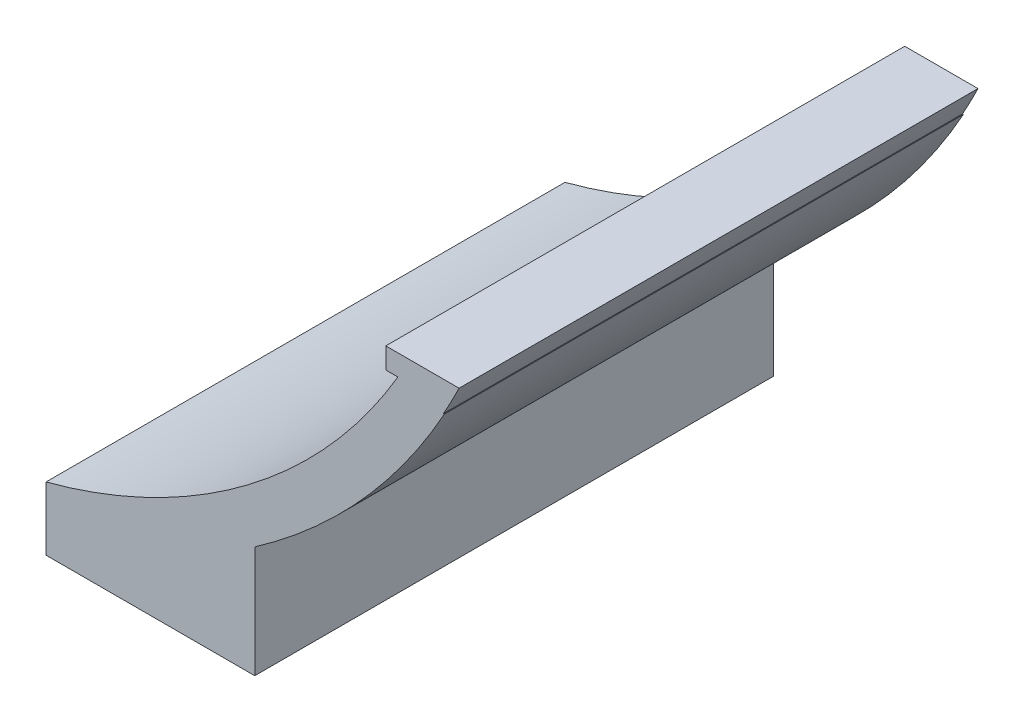
ISO-10303-21;
HEADER;
FILE_DESCRIPTION(('STEP AP214'),'2;1');
FILE_NAME('part.step','',(''),(''),'','','');
FILE_SCHEMA(('AUTOMOTIVE_DESIGN { 1 0 10303 214 1 1 1 1 }'));
ENDSEC;
DATA;
#1=APPLICATION_CONTEXT('core data for automotive mechanical design processes');
#2=APPLICATION_PROTOCOL_DEFINITION('international standard','automotive_design',2000,#1);
#3=PRODUCT_CONTEXT('',#1,'mechanical');
#4=PRODUCT('Part','Part','',(#3));
#5=PRODUCT_RELATED_PRODUCT_CATEGORY('part','',(#4));
#6=PRODUCT_DEFINITION_FORMATION('','',#4);
#7=PRODUCT_DEFINITION_CONTEXT('part definition',#1,'design');
#8=PRODUCT_DEFINITION('design','',#6,#7);
#9=PRODUCT_DEFINITION_SHAPE('','',#8);
#10=(LENGTH_UNIT() NAMED_UNIT(*) SI_UNIT(.MILLI.,.METRE.));
#11=(NAMED_UNIT(*) PLANE_ANGLE_UNIT() SI_UNIT($,.RADIAN.));
#12=(NAMED_UNIT(*) SI_UNIT($,.STERADIAN.) SOLID_ANGLE_UNIT());
#13=UNCERTAINTY_MEASURE_WITH_UNIT(LENGTH_MEASURE(1.E-05),#10,'distance_accuracy_value','');
#14=(GEOMETRIC_REPRESENTATION_CONTEXT(3) GLOBAL_UNCERTAINTY_ASSIGNED_CONTEXT((#13)) GLOBAL_UNIT_ASSIGNED_CONTEXT((#10,
#11,#12)) REPRESENTATION_CONTEXT('',''));
#15=CARTESIAN_POINT('',(0.,0.,0.));
#16=DIRECTION('',(0.,0.,1.));
#17=DIRECTION('',(1.,0.,0.));
#18=AXIS2_PLACEMENT_3D('',#15,#16,#17);
#19=CARTESIAN_POINT('',(0.,0.,174.));
#20=DIRECTION('',(0.,0.,-1.));
#21=DIRECTION('',(-1.,0.,0.));
#22=AXIS2_PLACEMENT_3D('',#19,#20,#21);
#23=CYLINDRICAL_SURFACE('',#22,210.);
#24=CARTESIAN_POINT('',(0.,0.,174.));
#25=DIRECTION('',(0.,0.,1.));
#26=DIRECTION('',(1.,0.,0.));
#27=AXIS2_PLACEMENT_3D('',#24,#25,#26);
#28=CIRCLE('',#27,210.);
#29=CARTESIAN_POINT('',(120.,-172.336879396141,174.));
#30=VERTEX_POINT('',#29);
#31=CARTESIAN_POINT('',(183.56470248934,-102.,174.));
#32=VERTEX_POINT('',#31);
#33=EDGE_CURVE('E179',#30,#32,#28,.T.);
#34=ORIENTED_EDGE('',*,*,#33,.F.);
#35=DIRECTION('',(0.,0.,1.));
#36=VECTOR('',#35,1.);
#37=CARTESIAN_POINT('',(120.,-172.336879396141,-115.957504903706));
#38=LINE('',#37,#36);
#39=CARTESIAN_POINT('',(120.,-172.336879396141,0.));
#40=VERTEX_POINT('',#39);
#41=EDGE_CURVE('E166',#40,#30,#38,.T.);
#42=ORIENTED_EDGE('',*,*,#41,.F.);
#43=CARTESIAN_POINT('',(0.,0.,0.));
#44=DIRECTION('',(0.,0.,1.));
#45=DIRECTION('',(1.,0.,0.));
#46=AXIS2_PLACEMENT_3D('',#43,#44,#45);
#47=CIRCLE('',#46,210.);
#48=CARTESIAN_POINT('',(183.56470248934,-102.,0.));
#49=VERTEX_POINT('',#48);
#50=EDGE_CURVE('E47',#40,#49,#47,.T.);
#51=ORIENTED_EDGE('',*,*,#50,.T.);
#52=DIRECTION('',(0.,0.,-1.));
#53=VECTOR('',#52,1.);
#54=CARTESIAN_POINT('',(183.56470248934,-102.,174.));
#55=LINE('',#54,#53);
#56=EDGE_CURVE('E201',#49,#32,#55,.F.);
#57=ORIENTED_EDGE('',*,*,#56,.T.);
#58=EDGE_LOOP('',(#34,#42,#51,#57));
#59=FACE_BOUND('',#58,.T.);
#60=ADVANCED_FACE('F43',(#59),#23,.T.);
#61=CARTESIAN_POINT('',(0.,-102.,-5.64183047049638));
#62=DIRECTION('',(0.,-1.,0.));
#63=DIRECTION('',(0.,0.,-1.));
#64=AXIS2_PLACEMENT_3D('',#61,#62,#63);
#65=PLANE('',#64);
#66=DIRECTION('',(-1.,0.,0.));
#67=VECTOR('',#66,1.);
#68=CARTESIAN_POINT('',(0.,-102.,0.));
#69=LINE('',#68,#67);
#70=CARTESIAN_POINT('',(183.278647146906,-102.,0.));
#71=VERTEX_POINT('',#70);
#72=EDGE_CURVE('E204',#49,#71,#69,.T.);
#73=ORIENTED_EDGE('',*,*,#72,.T.);
#74=DIRECTION('',(0.,0.,1.));
#75=VECTOR('',#74,1.);
#76=CARTESIAN_POINT('',(183.278647146906,-102.,-394.954823365914));
#77=LINE('',#76,#75);
#78=CARTESIAN_POINT('',(183.278647146906,-102.,174.));
#79=VERTEX_POINT('',#78);
#80=EDGE_CURVE('E142',#71,#79,#77,.T.);
#81=ORIENTED_EDGE('',*,*,#80,.T.);
#82=DIRECTION('',(1.,0.,0.));
#83=VECTOR('',#82,1.);
#84=CARTESIAN_POINT('',(0.,-102.,174.));
#85=LINE('',#84,#83);
#86=EDGE_CURVE('E108',#79,#32,#85,.T.);
#87=ORIENTED_EDGE('',*,*,#86,.T.);
#88=ORIENTED_EDGE('',*,*,#56,.F.);
#89=EDGE_LOOP('',(#73,#81,#87,#88));
#90=FACE_BOUND('',#89,.T.);
#91=ADVANCED_FACE('F208',(#90),#65,.F.);
#92=CARTESIAN_POINT('',(0.,0.,-394.954823365914));
#93=DIRECTION('',(0.,0.,1.));
#94=DIRECTION('',(1.,0.,0.));
#95=AXIS2_PLACEMENT_3D('',#92,#93,#94);
#96=CYLINDRICAL_SURFACE('',#95,209.75);
#97=ORIENTED_EDGE('',*,*,#80,.F.);
#98=CARTESIAN_POINT('',(0.,0.,0.));
#99=DIRECTION('',(0.,0.,1.));
#100=DIRECTION('',(1.,0.,0.));
#101=AXIS2_PLACEMENT_3D('',#98,#99,#100);
#102=CIRCLE('',#101,209.75);
#103=CARTESIAN_POINT('',(188.496850106308,-92.0000000000001,0.));
#104=VERTEX_POINT('',#103);
#105=EDGE_CURVE('E130',#104,#71,#102,.F.);
#106=ORIENTED_EDGE('',*,*,#105,.F.);
#107=DIRECTION('',(0.,0.,1.));
#108=VECTOR('',#107,1.);
#109=CARTESIAN_POINT('',(188.496850106308,-92.0000000000001,-394.954823365914));
#110=LINE('',#109,#108);
#111=CARTESIAN_POINT('',(188.496850106308,-92.0000000000001,174.));
#112=VERTEX_POINT('',#111);
#113=EDGE_CURVE('E140',#104,#112,#110,.T.);
#114=ORIENTED_EDGE('',*,*,#113,.T.);
#115=CARTESIAN_POINT('',(0.,0.,174.));
#116=DIRECTION('',(0.,0.,1.));
#117=DIRECTION('',(1.,0.,0.));
#118=AXIS2_PLACEMENT_3D('',#115,#116,#117);
#119=CIRCLE('',#118,209.75);
#120=EDGE_CURVE('E157',#79,#112,#119,.T.);
#121=ORIENTED_EDGE('',*,*,#120,.F.);
#122=EDGE_LOOP('',(#97,#106,#114,#121));
#123=FACE_BOUND('',#122,.T.);
#124=ADVANCED_FACE('F138',(#123),#96,.T.);
#125=CARTESIAN_POINT('',(171.933126534708,-92.,-394.954823365914));
#126=DIRECTION('',(0.,1.,0.));
#127=DIRECTION('',(0.,0.,1.));
#128=AXIS2_PLACEMENT_3D('',#125,#126,#127);
#129=PLANE('',#128);
#130=DIRECTION('',(1.,0.,0.));
#131=VECTOR('',#130,1.);
#132=CARTESIAN_POINT('',(171.933126534708,-92.,0.));
#133=LINE('',#132,#131);
#134=CARTESIAN_POINT('',(163.933126534708,-92.,0.));
#135=VERTEX_POINT('',#134);
#136=EDGE_CURVE('E99',#135,#104,#133,.T.);
#137=ORIENTED_EDGE('',*,*,#136,.F.);
#138=DIRECTION('',(0.,0.,-1.));
#139=VECTOR('',#138,1.);
#140=CARTESIAN_POINT('',(163.933126534708,-92.,183.45827557051));
#141=LINE('',#140,#139);
#142=CARTESIAN_POINT('',(163.933126534708,-92.,174.));
#143=VERTEX_POINT('',#142);
#144=EDGE_CURVE('E150',#143,#135,#141,.T.);
#145=ORIENTED_EDGE('',*,*,#144,.F.);
#146=DIRECTION('',(-1.,0.,0.));
#147=VECTOR('',#146,1.);
#148=CARTESIAN_POINT('',(171.933126534708,-92.,174.));
#149=LINE('',#148,#147);
#150=EDGE_CURVE('E146',#112,#143,#149,.T.);
#151=ORIENTED_EDGE('',*,*,#150,.F.);
#152=ORIENTED_EDGE('',*,*,#113,.F.);
#153=EDGE_LOOP('',(#137,#145,#151,#152));
#154=FACE_BOUND('',#153,.T.);
#155=ADVANCED_FACE('F145',(#154),#129,.T.);
#156=CARTESIAN_POINT('',(163.933126534708,-92.,183.45827557051));
#157=DIRECTION('',(-1.,0.,0.));
#158=DIRECTION('',(0.,0.,1.));
#159=AXIS2_PLACEMENT_3D('',#156,#157,#158);
#160=PLANE('',#159);
#161=DIRECTION('',(0.,0.,-1.));
#162=VECTOR('',#161,1.);
#163=CARTESIAN_POINT('',(163.933126534708,-99.,183.45827557051));
#164=LINE('',#163,#162);
#165=CARTESIAN_POINT('',(163.933126534708,-99.,174.));
#166=VERTEX_POINT('',#165);
#167=CARTESIAN_POINT('',(163.933126534708,-99.,0.));
#168=VERTEX_POINT('',#167);
#169=EDGE_CURVE('E163',#166,#168,#164,.T.);
#170=ORIENTED_EDGE('',*,*,#169,.F.);
#171=DIRECTION('',(0.,1.,0.));
#172=VECTOR('',#171,1.);
#173=CARTESIAN_POINT('',(163.933126534708,-92.,174.));
#174=LINE('',#173,#172);
#175=EDGE_CURVE('E147',#166,#143,#174,.T.);
#176=ORIENTED_EDGE('',*,*,#175,.T.);
#177=ORIENTED_EDGE('',*,*,#144,.T.);
#178=DIRECTION('',(0.,1.,0.));
#179=VECTOR('',#178,1.);
#180=CARTESIAN_POINT('',(163.933126534708,-92.,0.));
#181=LINE('',#180,#179);
#182=EDGE_CURVE('E133',#168,#135,#181,.T.);
#183=ORIENTED_EDGE('',*,*,#182,.F.);
#184=EDGE_LOOP('',(#170,#176,#177,#183));
#185=FACE_BOUND('',#184,.T.);
#186=ADVANCED_FACE('F224',(#185),#160,.T.);
#187=CARTESIAN_POINT('',(120.,0.,-115.957504903706));
#188=DIRECTION('',(1.,0.,0.));
#189=DIRECTION('',(0.,0.,-1.));
#190=AXIS2_PLACEMENT_3D('',#187,#188,#189);
#191=PLANE('',#190);
#192=DIRECTION('',(0.,-1.,0.));
#193=VECTOR('',#192,1.);
#194=CARTESIAN_POINT('',(120.,0.,0.));
#195=LINE('',#194,#193);
#196=CARTESIAN_POINT('',(120.,-209.75,0.));
#197=VERTEX_POINT('',#196);
#198=EDGE_CURVE('E143',#40,#197,#195,.T.);
#199=ORIENTED_EDGE('',*,*,#198,.F.);
#200=ORIENTED_EDGE('',*,*,#41,.T.);
#201=DIRECTION('',(0.,1.,0.));
#202=VECTOR('',#201,1.);
#203=CARTESIAN_POINT('',(120.,0.,174.));
#204=LINE('',#203,#202);
#205=CARTESIAN_POINT('',(120.,-209.75,174.));
#206=VERTEX_POINT('',#205);
#207=EDGE_CURVE('E180',#206,#30,#204,.T.);
#208=ORIENTED_EDGE('',*,*,#207,.F.);
#209=DIRECTION('',(0.,0.,1.));
#210=VECTOR('',#209,1.);
#211=CARTESIAN_POINT('',(120.,-209.75,-115.957504903706));
#212=LINE('',#211,#210);
#213=EDGE_CURVE('E165',#197,#206,#212,.T.);
#214=ORIENTED_EDGE('',*,*,#213,.F.);
#215=EDGE_LOOP('',(#199,#200,#208,#214));
#216=FACE_BOUND('',#215,.T.);
#217=ADVANCED_FACE('F222',(#216),#191,.T.);
#218=CARTESIAN_POINT('',(163.933126534708,-99.,183.45827557051));
#219=DIRECTION('',(0.,-1.,0.));
#220=DIRECTION('',(1.,0.,0.));
#221=AXIS2_PLACEMENT_3D('',#218,#219,#220);
#222=PLANE('',#221);
#223=DIRECTION('',(0.,0.,-1.));
#224=VECTOR('',#223,1.);
#225=CARTESIAN_POINT('',(168.,-99.,183.45827557051));
#226=LINE('',#225,#224);
#227=CARTESIAN_POINT('',(168.,-99.,174.));
#228=VERTEX_POINT('',#227);
#229=CARTESIAN_POINT('',(168.,-99.,0.));
#230=VERTEX_POINT('',#229);
#231=EDGE_CURVE('E159',#228,#230,#226,.T.);
#232=ORIENTED_EDGE('',*,*,#231,.F.);
#233=DIRECTION('',(-1.,0.,0.));
#234=VECTOR('',#233,1.);
#235=CARTESIAN_POINT('',(163.933126534708,-99.,174.));
#236=LINE('',#235,#234);
#237=EDGE_CURVE('E77',#228,#166,#236,.T.);
#238=ORIENTED_EDGE('',*,*,#237,.T.);
#239=ORIENTED_EDGE('',*,*,#169,.T.);
#240=DIRECTION('',(-1.,0.,0.));
#241=VECTOR('',#240,1.);
#242=CARTESIAN_POINT('',(163.933126534708,-99.,0.));
#243=LINE('',#242,#241);
#244=EDGE_CURVE('E169',#230,#168,#243,.T.);
#245=ORIENTED_EDGE('',*,*,#244,.F.);
#246=EDGE_LOOP('',(#232,#238,#239,#245));
#247=FACE_BOUND('',#246,.T.);
#248=ADVANCED_FACE('F186',(#247),#222,.T.);
#249=CARTESIAN_POINT('',(0.,-209.75,-115.957504903706));
#250=DIRECTION('',(0.,-1.,0.));
#251=DIRECTION('',(1.,0.,0.));
#252=AXIS2_PLACEMENT_3D('',#249,#250,#251);
#253=PLANE('',#252);
#254=DIRECTION('',(1.,0.,0.));
#255=VECTOR('',#254,1.);
#256=CARTESIAN_POINT('',(0.,-209.75,174.));
#257=LINE('',#256,#255);
#258=CARTESIAN_POINT('',(50.,-209.75,174.));
#259=VERTEX_POINT('',#258);
#260=EDGE_CURVE('E176',#259,#206,#257,.T.);
#261=ORIENTED_EDGE('',*,*,#260,.F.);
#262=DIRECTION('',(0.,0.,1.));
#263=VECTOR('',#262,1.);
#264=CARTESIAN_POINT('',(50.,-209.75,-480.));
#265=LINE('',#264,#263);
#266=CARTESIAN_POINT('',(50.,-209.75,0.));
#267=VERTEX_POINT('',#266);
#268=EDGE_CURVE('E12',#267,#259,#265,.T.);
#269=ORIENTED_EDGE('',*,*,#268,.F.);
#270=DIRECTION('',(-1.,0.,0.));
#271=VECTOR('',#270,1.);
#272=CARTESIAN_POINT('',(0.,-209.75,0.));
#273=LINE('',#272,#271);
#274=EDGE_CURVE('E190',#197,#267,#273,.T.);
#275=ORIENTED_EDGE('',*,*,#274,.F.);
#276=ORIENTED_EDGE('',*,*,#213,.T.);
#277=EDGE_LOOP('',(#261,#269,#275,#276));
#278=FACE_BOUND('',#277,.T.);
#279=ADVANCED_FACE('F221',(#278),#253,.T.);
#280=CARTESIAN_POINT('',(0.,0.,-365.268394471791));
#281=DIRECTION('',(0.,0.,1.));
#282=DIRECTION('',(1.,0.,0.));
#283=AXIS2_PLACEMENT_3D('',#280,#281,#282);
#284=CYLINDRICAL_SURFACE('',#283,195.);
#285=CARTESIAN_POINT('',(0.,0.,0.));
#286=DIRECTION('',(0.,0.,1.));
#287=DIRECTION('',(1.,0.,0.));
#288=AXIS2_PLACEMENT_3D('',#285,#286,#287);
#289=CIRCLE('',#288,195.);
#290=CARTESIAN_POINT('',(50.,-188.480768249708,0.));
#291=VERTEX_POINT('',#290);
#292=EDGE_CURVE('E162',#291,#230,#289,.T.);
#293=ORIENTED_EDGE('',*,*,#292,.F.);
#294=DIRECTION('',(0.,0.,1.));
#295=VECTOR('',#294,1.);
#296=CARTESIAN_POINT('',(50.,-188.480768249708,-365.268394471791));
#297=LINE('',#296,#295);
#298=CARTESIAN_POINT('',(50.,-188.480768249708,174.));
#299=VERTEX_POINT('',#298);
#300=EDGE_CURVE('E62',#291,#299,#297,.T.);
#301=ORIENTED_EDGE('',*,*,#300,.T.);
#302=CARTESIAN_POINT('',(0.,0.,174.));
#303=DIRECTION('',(0.,0.,-1.));
#304=DIRECTION('',(1.,0.,0.));
#305=AXIS2_PLACEMENT_3D('',#302,#303,#304);
#306=CIRCLE('',#305,195.);
#307=EDGE_CURVE('E155',#228,#299,#306,.T.);
#308=ORIENTED_EDGE('',*,*,#307,.F.);
#309=ORIENTED_EDGE('',*,*,#231,.T.);
#310=EDGE_LOOP('',(#293,#301,#308,#309));
#311=FACE_BOUND('',#310,.T.);
#312=ADVANCED_FACE('F189',(#311),#284,.F.);
#313=CARTESIAN_POINT('',(0.,0.,0.));
#314=DIRECTION('',(0.,0.,1.));
#315=DIRECTION('',(1.,0.,0.));
#316=AXIS2_PLACEMENT_3D('',#313,#314,#315);
#317=PLANE('',#316);
#318=DIRECTION('',(0.,-1.,0.));
#319=VECTOR('',#318,1.);
#320=CARTESIAN_POINT('',(50.,0.,0.));
#321=LINE('',#320,#319);
#322=EDGE_CURVE('E53',#291,#267,#321,.T.);
#323=ORIENTED_EDGE('',*,*,#322,.F.);
#324=ORIENTED_EDGE('',*,*,#292,.T.);
#325=ORIENTED_EDGE('',*,*,#244,.T.);
#326=ORIENTED_EDGE('',*,*,#182,.T.);
#327=ORIENTED_EDGE('',*,*,#136,.T.);
#328=ORIENTED_EDGE('',*,*,#105,.T.);
#329=ORIENTED_EDGE('',*,*,#72,.F.);
#330=ORIENTED_EDGE('',*,*,#50,.F.);
#331=ORIENTED_EDGE('',*,*,#198,.T.);
#332=ORIENTED_EDGE('',*,*,#274,.T.);
#333=EDGE_LOOP('',(#323,#324,#325,#326,#327,#328,#329,#330,#331,#332));
#334=FACE_BOUND('',#333,.T.);
#335=ADVANCED_FACE('F128',(#334),#317,.F.);
#336=CARTESIAN_POINT('',(0.,0.,174.));
#337=DIRECTION('',(0.,0.,1.));
#338=DIRECTION('',(1.,0.,0.));
#339=AXIS2_PLACEMENT_3D('',#336,#337,#338);
#340=PLANE('',#339);
#341=ORIENTED_EDGE('',*,*,#307,.T.);
#342=DIRECTION('',(0.,-1.,0.));
#343=VECTOR('',#342,1.);
#344=CARTESIAN_POINT('',(50.,0.,174.));
#345=LINE('',#344,#343);
#346=EDGE_CURVE('E173',#299,#259,#345,.T.);
#347=ORIENTED_EDGE('',*,*,#346,.T.);
#348=ORIENTED_EDGE('',*,*,#260,.T.);
#349=ORIENTED_EDGE('',*,*,#207,.T.);
#350=ORIENTED_EDGE('',*,*,#33,.T.);
#351=ORIENTED_EDGE('',*,*,#86,.F.);
#352=ORIENTED_EDGE('',*,*,#120,.T.);
#353=ORIENTED_EDGE('',*,*,#150,.T.);
#354=ORIENTED_EDGE('',*,*,#175,.F.);
#355=ORIENTED_EDGE('',*,*,#237,.F.);
#356=EDGE_LOOP('',(#341,#347,#348,#349,#350,#351,#352,#353,#354,#355));
#357=FACE_BOUND('',#356,.T.);
#358=ADVANCED_FACE('F45',(#357),#340,.T.);
#359=CARTESIAN_POINT('',(50.,0.,-480.));
#360=DIRECTION('',(-1.,0.,0.));
#361=DIRECTION('',(0.,0.,1.));
#362=AXIS2_PLACEMENT_3D('',#359,#360,#361);
#363=PLANE('',#362);
#364=ORIENTED_EDGE('',*,*,#322,.T.);
#365=ORIENTED_EDGE('',*,*,#268,.T.);
#366=ORIENTED_EDGE('',*,*,#346,.F.);
#367=ORIENTED_EDGE('',*,*,#300,.F.);
#368=EDGE_LOOP('',(#364,#365,#366,#367));
#369=FACE_BOUND('',#368,.T.);
#370=ADVANCED_FACE('F243',(#369),#363,.T.);
#371=CLOSED_SHELL('',(#60,#91,#124,#155,#186,#217,#248,#279,#312,#335,#358,#370));
#372=MANIFOLD_SOLID_BREP('B2',#371);
#373=ADVANCED_BREP_SHAPE_REPRESENTATION('',(#18,#372),#14);
#374=SHAPE_DEFINITION_REPRESENTATION(#9,#373);
ENDSEC;
END-ISO-10303-21;
